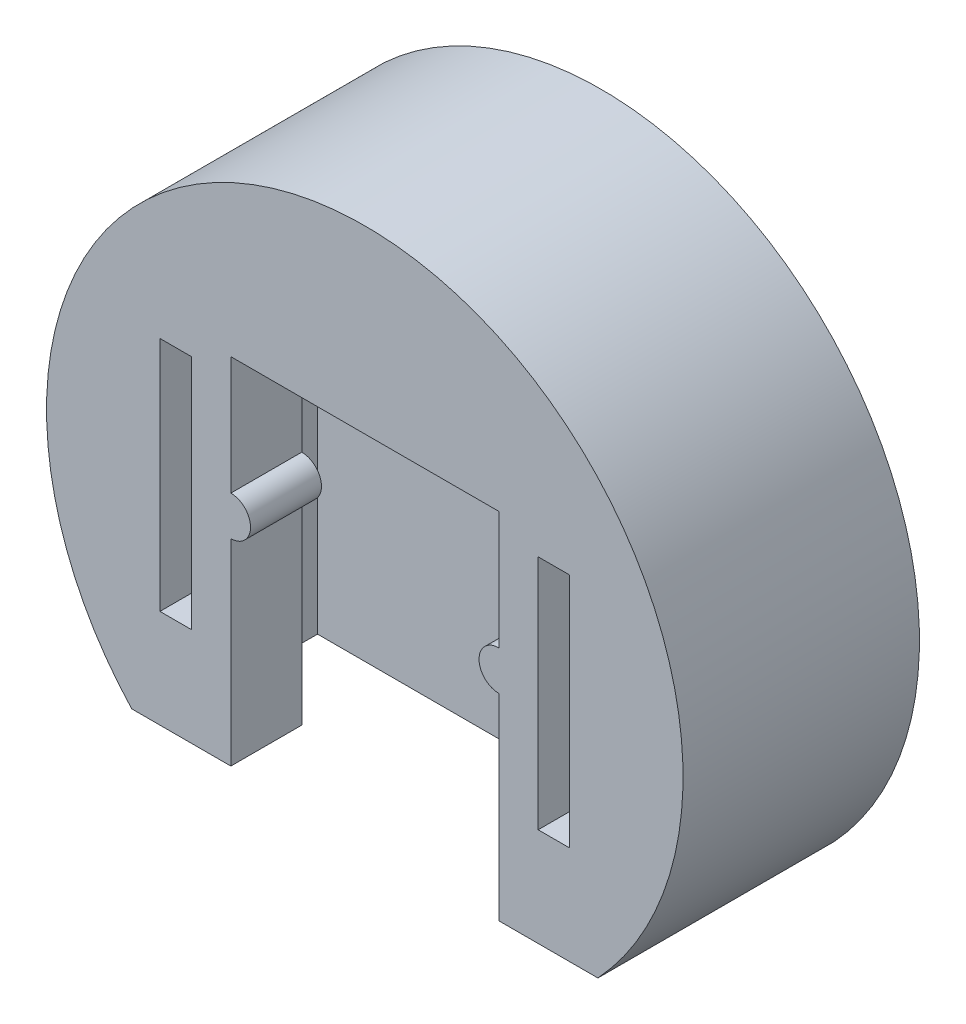
ISO-10303-21;
HEADER;
FILE_DESCRIPTION(('STEP AP214'),'2;1');
FILE_NAME('part.step','',(''),(''),'','','');
FILE_SCHEMA(('AUTOMOTIVE_DESIGN { 1 0 10303 214 1 1 1 1 }'));
ENDSEC;
DATA;
#1=APPLICATION_CONTEXT('core data for automotive mechanical design processes');
#2=APPLICATION_PROTOCOL_DEFINITION('international standard','automotive_design',2000,#1);
#3=PRODUCT_CONTEXT('',#1,'mechanical');
#4=PRODUCT('Part','Part','',(#3));
#5=PRODUCT_RELATED_PRODUCT_CATEGORY('part','',(#4));
#6=PRODUCT_DEFINITION_FORMATION('','',#4);
#7=PRODUCT_DEFINITION_CONTEXT('part definition',#1,'design');
#8=PRODUCT_DEFINITION('design','',#6,#7);
#9=PRODUCT_DEFINITION_SHAPE('','',#8);
#10=(LENGTH_UNIT() NAMED_UNIT(*) SI_UNIT(.MILLI.,.METRE.));
#11=(NAMED_UNIT(*) PLANE_ANGLE_UNIT() SI_UNIT($,.RADIAN.));
#12=(NAMED_UNIT(*) SI_UNIT($,.STERADIAN.) SOLID_ANGLE_UNIT());
#13=UNCERTAINTY_MEASURE_WITH_UNIT(LENGTH_MEASURE(1.E-05),#10,'distance_accuracy_value','');
#14=(GEOMETRIC_REPRESENTATION_CONTEXT(3) GLOBAL_UNCERTAINTY_ASSIGNED_CONTEXT((#13)) GLOBAL_UNIT_ASSIGNED_CONTEXT((#10,
#11,#12)) REPRESENTATION_CONTEXT('',''));
#15=CARTESIAN_POINT('',(0.,0.,0.));
#16=DIRECTION('',(0.,0.,1.));
#17=DIRECTION('',(1.,0.,0.));
#18=AXIS2_PLACEMENT_3D('',#15,#16,#17);
#19=CARTESIAN_POINT('',(3.4,3.5,2.));
#20=DIRECTION('',(1.,0.,0.));
#21=DIRECTION('',(0.,1.,0.));
#22=AXIS2_PLACEMENT_3D('',#19,#20,#21);
#23=PLANE('',#22);
#24=DIRECTION('',(0.,-1.,0.));
#25=VECTOR('',#24,1.);
#26=CARTESIAN_POINT('',(3.4,3.5,4.2));
#27=LINE('',#26,#25);
#28=CARTESIAN_POINT('',(3.4,3.5,4.2));
#29=VERTEX_POINT('',#28);
#30=CARTESIAN_POINT('',(3.4,0.5,4.2));
#31=VERTEX_POINT('',#30);
#32=EDGE_CURVE('E205',#29,#31,#27,.T.);
#33=ORIENTED_EDGE('',*,*,#32,.T.);
#34=DIRECTION('',(0.,0.,1.));
#35=VECTOR('',#34,1.);
#36=CARTESIAN_POINT('',(3.4,0.5,2.78578643762691));
#37=LINE('',#36,#35);
#38=CARTESIAN_POINT('',(3.4,0.5,6.));
#39=VERTEX_POINT('',#38);
#40=EDGE_CURVE('E216',#31,#39,#37,.T.);
#41=ORIENTED_EDGE('',*,*,#40,.T.);
#42=DIRECTION('',(0.,1.,0.));
#43=VECTOR('',#42,1.);
#44=CARTESIAN_POINT('',(3.4,3.5,6.));
#45=LINE('',#44,#43);
#46=CARTESIAN_POINT('',(3.4,3.5,6.));
#47=VERTEX_POINT('',#46);
#48=EDGE_CURVE('E328',#39,#47,#45,.T.);
#49=ORIENTED_EDGE('',*,*,#48,.T.);
#50=DIRECTION('',(0.,0.,1.));
#51=VECTOR('',#50,1.);
#52=CARTESIAN_POINT('',(3.4,3.5,2.));
#53=LINE('',#52,#51);
#54=EDGE_CURVE('E335',#29,#47,#53,.T.);
#55=ORIENTED_EDGE('',*,*,#54,.F.);
#56=EDGE_LOOP('',(#33,#41,#49,#55));
#57=FACE_BOUND('',#56,.T.);
#58=ADVANCED_FACE('F32',(#57),#23,.F.);
#59=CARTESIAN_POINT('',(-3.4,3.5,2.));
#60=DIRECTION('',(-1.,0.,0.));
#61=DIRECTION('',(0.,-1.,0.));
#62=AXIS2_PLACEMENT_3D('',#59,#60,#61);
#63=PLANE('',#62);
#64=DIRECTION('',(0.,1.,0.));
#65=VECTOR('',#64,1.);
#66=CARTESIAN_POINT('',(-3.4,3.5,4.2));
#67=LINE('',#66,#65);
#68=CARTESIAN_POINT('',(-3.4,-5.5,4.2));
#69=VERTEX_POINT('',#68);
#70=CARTESIAN_POINT('',(-3.4,-0.5,4.2));
#71=VERTEX_POINT('',#70);
#72=EDGE_CURVE('E319',#69,#71,#67,.T.);
#73=ORIENTED_EDGE('',*,*,#72,.T.);
#74=DIRECTION('',(0.,0.,1.));
#75=VECTOR('',#74,1.);
#76=CARTESIAN_POINT('',(-3.4,-0.5,2.78578643762691));
#77=LINE('',#76,#75);
#78=CARTESIAN_POINT('',(-3.4,-0.5,6.));
#79=VERTEX_POINT('',#78);
#80=EDGE_CURVE('E234',#71,#79,#77,.T.);
#81=ORIENTED_EDGE('',*,*,#80,.T.);
#82=DIRECTION('',(0.,-1.,0.));
#83=VECTOR('',#82,1.);
#84=CARTESIAN_POINT('',(-3.4,3.5,6.));
#85=LINE('',#84,#83);
#86=CARTESIAN_POINT('',(-3.4,-5.5,6.));
#87=VERTEX_POINT('',#86);
#88=EDGE_CURVE('E321',#79,#87,#85,.T.);
#89=ORIENTED_EDGE('',*,*,#88,.T.);
#90=DIRECTION('',(0.,0.,1.));
#91=VECTOR('',#90,1.);
#92=CARTESIAN_POINT('',(-3.4,-5.5,2.));
#93=LINE('',#92,#91);
#94=EDGE_CURVE('E324',#69,#87,#93,.T.);
#95=ORIENTED_EDGE('',*,*,#94,.F.);
#96=EDGE_LOOP('',(#73,#81,#89,#95));
#97=FACE_BOUND('',#96,.T.);
#98=ADVANCED_FACE('F404',(#97),#63,.F.);
#99=CARTESIAN_POINT('',(0.,0.,6.));
#100=DIRECTION('',(0.,0.,-1.));
#101=DIRECTION('',(-1.,0.,0.));
#102=AXIS2_PLACEMENT_3D('',#99,#100,#101);
#103=CYLINDRICAL_SURFACE('',#102,8.07774721070176);
#104=CARTESIAN_POINT('',(0.,0.,0.));
#105=DIRECTION('',(0.,0.,1.));
#106=DIRECTION('',(1.,0.,0.));
#107=AXIS2_PLACEMENT_3D('',#104,#105,#106);
#108=CIRCLE('',#107,8.07774721070176);
#109=CARTESIAN_POINT('',(5.91607978309962,-5.5,0.));
#110=VERTEX_POINT('',#109);
#111=CARTESIAN_POINT('',(-5.91607978309962,-5.5,0.));
#112=VERTEX_POINT('',#111);
#113=EDGE_CURVE('E334',#110,#112,#108,.T.);
#114=ORIENTED_EDGE('',*,*,#113,.T.);
#115=DIRECTION('',(0.,0.,-1.));
#116=VECTOR('',#115,1.);
#117=CARTESIAN_POINT('',(-5.91607978309962,-5.5,6.));
#118=LINE('',#117,#116);
#119=CARTESIAN_POINT('',(-5.91607978309962,-5.5,6.));
#120=VERTEX_POINT('',#119);
#121=EDGE_CURVE('E206',#120,#112,#118,.T.);
#122=ORIENTED_EDGE('',*,*,#121,.F.);
#123=CARTESIAN_POINT('',(0.,0.,6.));
#124=DIRECTION('',(0.,0.,1.));
#125=DIRECTION('',(1.,0.,0.));
#126=AXIS2_PLACEMENT_3D('',#123,#124,#125);
#127=CIRCLE('',#126,8.07774721070176);
#128=CARTESIAN_POINT('',(5.91607978309962,-5.5,6.));
#129=VERTEX_POINT('',#128);
#130=EDGE_CURVE('E342',#129,#120,#127,.T.);
#131=ORIENTED_EDGE('',*,*,#130,.F.);
#132=DIRECTION('',(0.,0.,-1.));
#133=VECTOR('',#132,1.);
#134=CARTESIAN_POINT('',(5.91607978309962,-5.5,6.));
#135=LINE('',#134,#133);
#136=EDGE_CURVE('E350',#129,#110,#135,.T.);
#137=ORIENTED_EDGE('',*,*,#136,.T.);
#138=EDGE_LOOP('',(#114,#122,#131,#137));
#139=FACE_BOUND('',#138,.T.);
#140=ADVANCED_FACE('F410',(#139),#103,.T.);
#141=CARTESIAN_POINT('',(5.91607978309962,-5.5,6.));
#142=DIRECTION('',(0.,1.,0.));
#143=DIRECTION('',(-1.,0.,0.));
#144=AXIS2_PLACEMENT_3D('',#141,#142,#143);
#145=PLANE('',#144);
#146=DIRECTION('',(0.,0.,-1.));
#147=VECTOR('',#146,1.);
#148=CARTESIAN_POINT('',(-5.2,-5.5,4.2));
#149=LINE('',#148,#147);
#150=CARTESIAN_POINT('',(-5.2,-5.5,4.2));
#151=VERTEX_POINT('',#150);
#152=CARTESIAN_POINT('',(-5.2,-5.5,2.));
#153=VERTEX_POINT('',#152);
#154=EDGE_CURVE('E312',#151,#153,#149,.T.);
#155=ORIENTED_EDGE('',*,*,#154,.F.);
#156=DIRECTION('',(1.,0.,0.));
#157=VECTOR('',#156,1.);
#158=CARTESIAN_POINT('',(-5.2,-5.5,4.2));
#159=LINE('',#158,#157);
#160=EDGE_CURVE('E292',#151,#69,#159,.T.);
#161=ORIENTED_EDGE('',*,*,#160,.T.);
#162=ORIENTED_EDGE('',*,*,#94,.T.);
#163=DIRECTION('',(1.,0.,0.));
#164=VECTOR('',#163,1.);
#165=CARTESIAN_POINT('',(5.91607978309962,-5.5,6.));
#166=LINE('',#165,#164);
#167=EDGE_CURVE('E347',#120,#87,#166,.T.);
#168=ORIENTED_EDGE('',*,*,#167,.F.);
#169=ORIENTED_EDGE('',*,*,#121,.T.);
#170=DIRECTION('',(1.,0.,0.));
#171=VECTOR('',#170,1.);
#172=CARTESIAN_POINT('',(5.91607978309962,-5.5,0.));
#173=LINE('',#172,#171);
#174=EDGE_CURVE('E346',#112,#110,#173,.T.);
#175=ORIENTED_EDGE('',*,*,#174,.T.);
#176=ORIENTED_EDGE('',*,*,#136,.F.);
#177=CARTESIAN_POINT('',(3.4,-5.5,6.));
#178=VERTEX_POINT('',#177);
#179=EDGE_CURVE('E345',#178,#129,#166,.T.);
#180=ORIENTED_EDGE('',*,*,#179,.F.);
#181=DIRECTION('',(0.,0.,1.));
#182=VECTOR('',#181,1.);
#183=CARTESIAN_POINT('',(3.4,-5.5,2.));
#184=LINE('',#183,#182);
#185=CARTESIAN_POINT('',(3.4,-5.5,4.2));
#186=VERTEX_POINT('',#185);
#187=EDGE_CURVE('E338',#186,#178,#184,.T.);
#188=ORIENTED_EDGE('',*,*,#187,.F.);
#189=CARTESIAN_POINT('',(5.2,-5.5,4.2));
#190=VERTEX_POINT('',#189);
#191=EDGE_CURVE('E202',#186,#190,#159,.T.);
#192=ORIENTED_EDGE('',*,*,#191,.T.);
#193=DIRECTION('',(0.,0.,-1.));
#194=VECTOR('',#193,1.);
#195=CARTESIAN_POINT('',(5.2,-5.5,4.2));
#196=LINE('',#195,#194);
#197=CARTESIAN_POINT('',(5.2,-5.5,2.));
#198=VERTEX_POINT('',#197);
#199=EDGE_CURVE('E302',#190,#198,#196,.T.);
#200=ORIENTED_EDGE('',*,*,#199,.T.);
#201=DIRECTION('',(1.,0.,0.));
#202=VECTOR('',#201,1.);
#203=CARTESIAN_POINT('',(-3.4,-5.5,2.));
#204=LINE('',#203,#202);
#205=EDGE_CURVE('E322',#153,#198,#204,.T.);
#206=ORIENTED_EDGE('',*,*,#205,.F.);
#207=EDGE_LOOP('',(#155,#161,#162,#168,#169,#175,#176,#180,#188,#192,#200,#206));
#208=FACE_BOUND('',#207,.T.);
#209=ADVANCED_FACE('F391',(#208),#145,.F.);
#210=CARTESIAN_POINT('',(0.,0.,6.));
#211=DIRECTION('',(0.,0.,1.));
#212=DIRECTION('',(1.,0.,0.));
#213=AXIS2_PLACEMENT_3D('',#210,#211,#212);
#214=PLANE('',#213);
#215=ORIENTED_EDGE('',*,*,#48,.F.);
#216=CARTESIAN_POINT('',(3.4,0.,6.));
#217=DIRECTION('',(0.,0.,1.));
#218=DIRECTION('',(1.,0.,0.));
#219=AXIS2_PLACEMENT_3D('',#216,#217,#218);
#220=CIRCLE('',#219,0.5);
#221=CARTESIAN_POINT('',(3.4,-0.5,6.));
#222=VERTEX_POINT('',#221);
#223=EDGE_CURVE('E220',#39,#222,#220,.T.);
#224=ORIENTED_EDGE('',*,*,#223,.T.);
#225=EDGE_CURVE('E212',#178,#222,#45,.T.);
#226=ORIENTED_EDGE('',*,*,#225,.F.);
#227=ORIENTED_EDGE('',*,*,#179,.T.);
#228=ORIENTED_EDGE('',*,*,#130,.T.);
#229=ORIENTED_EDGE('',*,*,#167,.T.);
#230=ORIENTED_EDGE('',*,*,#88,.F.);
#231=CARTESIAN_POINT('',(-3.4,0.,6.));
#232=DIRECTION('',(0.,0.,1.));
#233=DIRECTION('',(1.,0.,0.));
#234=AXIS2_PLACEMENT_3D('',#231,#232,#233);
#235=CIRCLE('',#234,0.5);
#236=CARTESIAN_POINT('',(-3.4,0.5,6.));
#237=VERTEX_POINT('',#236);
#238=EDGE_CURVE('E225',#79,#237,#235,.T.);
#239=ORIENTED_EDGE('',*,*,#238,.T.);
#240=CARTESIAN_POINT('',(-3.4,3.5,6.));
#241=VERTEX_POINT('',#240);
#242=EDGE_CURVE('E326',#241,#237,#85,.T.);
#243=ORIENTED_EDGE('',*,*,#242,.F.);
#244=DIRECTION('',(-1.,0.,0.));
#245=VECTOR('',#244,1.);
#246=CARTESIAN_POINT('',(-3.4,3.5,6.));
#247=LINE('',#246,#245);
#248=EDGE_CURVE('E325',#47,#241,#247,.T.);
#249=ORIENTED_EDGE('',*,*,#248,.F.);
#250=EDGE_LOOP('',(#215,#224,#226,#227,#228,#229,#230,#239,#243,#249));
#251=FACE_BOUND('',#250,.T.);
#252=DIRECTION('',(0.,-1.,0.));
#253=VECTOR('',#252,1.);
#254=CARTESIAN_POINT('',(-5.2,-3.,6.));
#255=LINE('',#254,#253);
#256=CARTESIAN_POINT('',(-5.2,3.,6.));
#257=VERTEX_POINT('',#256);
#258=CARTESIAN_POINT('',(-5.2,-3.,6.));
#259=VERTEX_POINT('',#258);
#260=EDGE_CURVE('E237',#257,#259,#255,.T.);
#261=ORIENTED_EDGE('',*,*,#260,.F.);
#262=DIRECTION('',(-1.,0.,0.));
#263=VECTOR('',#262,1.);
#264=CARTESIAN_POINT('',(-5.2,3.,6.));
#265=LINE('',#264,#263);
#266=CARTESIAN_POINT('',(-4.4,3.,6.));
#267=VERTEX_POINT('',#266);
#268=EDGE_CURVE('E246',#267,#257,#265,.T.);
#269=ORIENTED_EDGE('',*,*,#268,.F.);
#270=DIRECTION('',(0.,1.,0.));
#271=VECTOR('',#270,1.);
#272=CARTESIAN_POINT('',(-4.4,-3.,6.));
#273=LINE('',#272,#271);
#274=CARTESIAN_POINT('',(-4.4,-3.,6.));
#275=VERTEX_POINT('',#274);
#276=EDGE_CURVE('E243',#275,#267,#273,.T.);
#277=ORIENTED_EDGE('',*,*,#276,.F.);
#278=DIRECTION('',(1.,0.,0.));
#279=VECTOR('',#278,1.);
#280=CARTESIAN_POINT('',(-5.2,-3.,6.));
#281=LINE('',#280,#279);
#282=EDGE_CURVE('E239',#259,#275,#281,.T.);
#283=ORIENTED_EDGE('',*,*,#282,.F.);
#284=EDGE_LOOP('',(#261,#269,#277,#283));
#285=FACE_BOUND('',#284,.T.);
#286=DIRECTION('',(0.,-1.,0.));
#287=VECTOR('',#286,1.);
#288=CARTESIAN_POINT('',(4.4,3.,6.));
#289=LINE('',#288,#287);
#290=CARTESIAN_POINT('',(4.4,3.,6.));
#291=VERTEX_POINT('',#290);
#292=CARTESIAN_POINT('',(4.4,-3.,6.));
#293=VERTEX_POINT('',#292);
#294=EDGE_CURVE('E236',#291,#293,#289,.T.);
#295=ORIENTED_EDGE('',*,*,#294,.F.);
#296=DIRECTION('',(-1.,0.,0.));
#297=VECTOR('',#296,1.);
#298=CARTESIAN_POINT('',(4.4,3.,6.));
#299=LINE('',#298,#297);
#300=CARTESIAN_POINT('',(5.2,3.,6.));
#301=VERTEX_POINT('',#300);
#302=EDGE_CURVE('E266',#301,#291,#299,.T.);
#303=ORIENTED_EDGE('',*,*,#302,.F.);
#304=DIRECTION('',(0.,1.,0.));
#305=VECTOR('',#304,1.);
#306=CARTESIAN_POINT('',(5.2,3.,6.));
#307=LINE('',#306,#305);
#308=CARTESIAN_POINT('',(5.2,-3.,6.));
#309=VERTEX_POINT('',#308);
#310=EDGE_CURVE('E263',#309,#301,#307,.T.);
#311=ORIENTED_EDGE('',*,*,#310,.F.);
#312=DIRECTION('',(1.,0.,0.));
#313=VECTOR('',#312,1.);
#314=CARTESIAN_POINT('',(4.4,-3.,6.));
#315=LINE('',#314,#313);
#316=EDGE_CURVE('E260',#293,#309,#315,.T.);
#317=ORIENTED_EDGE('',*,*,#316,.F.);
#318=EDGE_LOOP('',(#295,#303,#311,#317));
#319=FACE_BOUND('',#318,.T.);
#320=ADVANCED_FACE('F532',(#251,#285,#319),#214,.T.);
#321=CARTESIAN_POINT('',(0.,0.,0.));
#322=DIRECTION('',(0.,0.,1.));
#323=DIRECTION('',(1.,0.,0.));
#324=AXIS2_PLACEMENT_3D('',#321,#322,#323);
#325=PLANE('',#324);
#326=ORIENTED_EDGE('',*,*,#113,.F.);
#327=ORIENTED_EDGE('',*,*,#174,.F.);
#328=EDGE_LOOP('',(#326,#327));
#329=FACE_BOUND('',#328,.T.);
#330=ADVANCED_FACE('F426',(#329),#325,.F.);
#331=ORIENTED_EDGE('',*,*,#242,.T.);
#332=DIRECTION('',(0.,0.,1.));
#333=VECTOR('',#332,1.);
#334=CARTESIAN_POINT('',(-3.4,0.5,2.78578643762691));
#335=LINE('',#334,#333);
#336=CARTESIAN_POINT('',(-3.4,0.5,4.2));
#337=VERTEX_POINT('',#336);
#338=EDGE_CURVE('E231',#237,#337,#335,.F.);
#339=ORIENTED_EDGE('',*,*,#338,.T.);
#340=CARTESIAN_POINT('',(-3.4,3.5,4.2));
#341=VERTEX_POINT('',#340);
#342=EDGE_CURVE('E318',#337,#341,#67,.T.);
#343=ORIENTED_EDGE('',*,*,#342,.T.);
#344=DIRECTION('',(0.,0.,1.));
#345=VECTOR('',#344,1.);
#346=CARTESIAN_POINT('',(-3.4,3.5,2.));
#347=LINE('',#346,#345);
#348=EDGE_CURVE('E332',#341,#241,#347,.T.);
#349=ORIENTED_EDGE('',*,*,#348,.T.);
#350=EDGE_LOOP('',(#331,#339,#343,#349));
#351=FACE_BOUND('',#350,.T.);
#352=ADVANCED_FACE('F413',(#351),#63,.F.);
#353=CARTESIAN_POINT('',(-3.4,3.5,2.));
#354=DIRECTION('',(0.,1.,0.));
#355=DIRECTION('',(-1.,0.,0.));
#356=AXIS2_PLACEMENT_3D('',#353,#354,#355);
#357=PLANE('',#356);
#358=ORIENTED_EDGE('',*,*,#348,.F.);
#359=DIRECTION('',(1.,0.,0.));
#360=VECTOR('',#359,1.);
#361=CARTESIAN_POINT('',(-3.4,3.5,4.2));
#362=LINE('',#361,#360);
#363=EDGE_CURVE('E315',#341,#29,#362,.T.);
#364=ORIENTED_EDGE('',*,*,#363,.T.);
#365=ORIENTED_EDGE('',*,*,#54,.T.);
#366=ORIENTED_EDGE('',*,*,#248,.T.);
#367=EDGE_LOOP('',(#358,#364,#365,#366));
#368=FACE_BOUND('',#367,.T.);
#369=ADVANCED_FACE('F416',(#368),#357,.F.);
#370=ORIENTED_EDGE('',*,*,#225,.T.);
#371=DIRECTION('',(0.,0.,1.));
#372=VECTOR('',#371,1.);
#373=CARTESIAN_POINT('',(3.4,-0.5,2.78578643762691));
#374=LINE('',#373,#372);
#375=CARTESIAN_POINT('',(3.4,-0.5,4.2));
#376=VERTEX_POINT('',#375);
#377=EDGE_CURVE('E209',#222,#376,#374,.F.);
#378=ORIENTED_EDGE('',*,*,#377,.T.);
#379=EDGE_CURVE('E195',#376,#186,#27,.T.);
#380=ORIENTED_EDGE('',*,*,#379,.T.);
#381=ORIENTED_EDGE('',*,*,#187,.T.);
#382=EDGE_LOOP('',(#370,#378,#380,#381));
#383=FACE_BOUND('',#382,.T.);
#384=ADVANCED_FACE('F210',(#383),#23,.F.);
#385=CARTESIAN_POINT('',(0.,0.,2.));
#386=DIRECTION('',(0.,0.,1.));
#387=DIRECTION('',(1.,0.,0.));
#388=AXIS2_PLACEMENT_3D('',#385,#386,#387);
#389=PLANE('',#388);
#390=DIRECTION('',(-1.,0.,0.));
#391=VECTOR('',#390,1.);
#392=CARTESIAN_POINT('',(-5.2,5.1,2.));
#393=LINE('',#392,#391);
#394=CARTESIAN_POINT('',(4.7,5.1,2.));
#395=VERTEX_POINT('',#394);
#396=CARTESIAN_POINT('',(-4.7,5.1,2.));
#397=VERTEX_POINT('',#396);
#398=EDGE_CURVE('E307',#395,#397,#393,.T.);
#399=ORIENTED_EDGE('',*,*,#398,.T.);
#400=CARTESIAN_POINT('',(-4.7,4.6,2.));
#401=DIRECTION('',(0.,0.,1.));
#402=DIRECTION('',(1.,0.,0.));
#403=AXIS2_PLACEMENT_3D('',#400,#401,#402);
#404=CIRCLE('',#403,0.5);
#405=CARTESIAN_POINT('',(-5.2,4.6,2.));
#406=VERTEX_POINT('',#405);
#407=EDGE_CURVE('E371',#397,#406,#404,.T.);
#408=ORIENTED_EDGE('',*,*,#407,.T.);
#409=DIRECTION('',(0.,-1.,0.));
#410=VECTOR('',#409,1.);
#411=CARTESIAN_POINT('',(-5.2,5.1,2.));
#412=LINE('',#411,#410);
#413=EDGE_CURVE('E288',#406,#153,#412,.T.);
#414=ORIENTED_EDGE('',*,*,#413,.T.);
#415=ORIENTED_EDGE('',*,*,#205,.T.);
#416=DIRECTION('',(0.,1.,0.));
#417=VECTOR('',#416,1.);
#418=CARTESIAN_POINT('',(5.2,5.1,2.));
#419=LINE('',#418,#417);
#420=CARTESIAN_POINT('',(5.2,4.6,2.));
#421=VERTEX_POINT('',#420);
#422=EDGE_CURVE('E304',#198,#421,#419,.T.);
#423=ORIENTED_EDGE('',*,*,#422,.T.);
#424=CARTESIAN_POINT('',(4.7,4.6,2.));
#425=DIRECTION('',(0.,0.,1.));
#426=DIRECTION('',(1.,0.,0.));
#427=AXIS2_PLACEMENT_3D('',#424,#425,#426);
#428=CIRCLE('',#427,0.5);
#429=EDGE_CURVE('E369',#421,#395,#428,.T.);
#430=ORIENTED_EDGE('',*,*,#429,.T.);
#431=EDGE_LOOP('',(#399,#408,#414,#415,#423,#430));
#432=FACE_BOUND('',#431,.T.);
#433=ADVANCED_FACE('F383',(#432),#389,.T.);
#434=CARTESIAN_POINT('',(0.,0.,4.2));
#435=DIRECTION('',(0.,0.,1.));
#436=DIRECTION('',(1.,0.,0.));
#437=AXIS2_PLACEMENT_3D('',#434,#435,#436);
#438=PLANE('',#437);
#439=DIRECTION('',(0.,-1.,0.));
#440=VECTOR('',#439,1.);
#441=CARTESIAN_POINT('',(-5.2,5.1,4.2));
#442=LINE('',#441,#440);
#443=CARTESIAN_POINT('',(-5.2,4.6,4.2));
#444=VERTEX_POINT('',#443);
#445=CARTESIAN_POINT('',(-5.2,3.,4.2));
#446=VERTEX_POINT('',#445);
#447=EDGE_CURVE('E289',#444,#446,#442,.T.);
#448=ORIENTED_EDGE('',*,*,#447,.F.);
#449=CARTESIAN_POINT('',(-4.7,4.6,4.2));
#450=DIRECTION('',(0.,0.,1.));
#451=DIRECTION('',(1.,0.,0.));
#452=AXIS2_PLACEMENT_3D('',#449,#450,#451);
#453=CIRCLE('',#452,0.5);
#454=CARTESIAN_POINT('',(-4.7,5.1,4.2));
#455=VERTEX_POINT('',#454);
#456=EDGE_CURVE('E40',#444,#455,#453,.F.);
#457=ORIENTED_EDGE('',*,*,#456,.T.);
#458=DIRECTION('',(-1.,0.,0.));
#459=VECTOR('',#458,1.);
#460=CARTESIAN_POINT('',(-5.2,5.1,4.2));
#461=LINE('',#460,#459);
#462=CARTESIAN_POINT('',(4.7,5.1,4.2));
#463=VERTEX_POINT('',#462);
#464=EDGE_CURVE('E299',#463,#455,#461,.T.);
#465=ORIENTED_EDGE('',*,*,#464,.F.);
#466=CARTESIAN_POINT('',(4.7,4.6,4.2));
#467=DIRECTION('',(0.,0.,1.));
#468=DIRECTION('',(1.,0.,0.));
#469=AXIS2_PLACEMENT_3D('',#466,#467,#468);
#470=CIRCLE('',#469,0.5);
#471=CARTESIAN_POINT('',(5.2,4.6,4.2));
#472=VERTEX_POINT('',#471);
#473=EDGE_CURVE('E47',#463,#472,#470,.F.);
#474=ORIENTED_EDGE('',*,*,#473,.T.);
#475=DIRECTION('',(0.,1.,0.));
#476=VECTOR('',#475,1.);
#477=CARTESIAN_POINT('',(5.2,5.1,4.2));
#478=LINE('',#477,#476);
#479=CARTESIAN_POINT('',(5.2,3.,4.2));
#480=VERTEX_POINT('',#479);
#481=EDGE_CURVE('E295',#480,#472,#478,.T.);
#482=ORIENTED_EDGE('',*,*,#481,.F.);
#483=DIRECTION('',(-1.,0.,0.));
#484=VECTOR('',#483,1.);
#485=CARTESIAN_POINT('',(0.,3.,4.2));
#486=LINE('',#485,#484);
#487=CARTESIAN_POINT('',(4.4,3.,4.2));
#488=VERTEX_POINT('',#487);
#489=EDGE_CURVE('E279',#480,#488,#486,.T.);
#490=ORIENTED_EDGE('',*,*,#489,.T.);
#491=DIRECTION('',(0.,-1.,0.));
#492=VECTOR('',#491,1.);
#493=CARTESIAN_POINT('',(4.4,0.,4.2));
#494=LINE('',#493,#492);
#495=CARTESIAN_POINT('',(4.4,-3.,4.2));
#496=VERTEX_POINT('',#495);
#497=EDGE_CURVE('E358',#488,#496,#494,.T.);
#498=ORIENTED_EDGE('',*,*,#497,.T.);
#499=DIRECTION('',(1.,0.,0.));
#500=VECTOR('',#499,1.);
#501=CARTESIAN_POINT('',(0.,-3.,4.2));
#502=LINE('',#501,#500);
#503=CARTESIAN_POINT('',(5.2,-3.,4.2));
#504=VERTEX_POINT('',#503);
#505=EDGE_CURVE('E252',#496,#504,#502,.T.);
#506=ORIENTED_EDGE('',*,*,#505,.T.);
#507=EDGE_CURVE('E296',#190,#504,#478,.T.);
#508=ORIENTED_EDGE('',*,*,#507,.F.);
#509=ORIENTED_EDGE('',*,*,#191,.F.);
#510=ORIENTED_EDGE('',*,*,#379,.F.);
#511=CARTESIAN_POINT('',(3.4,0.,4.2));
#512=DIRECTION('',(0.,0.,1.));
#513=DIRECTION('',(1.,0.,0.));
#514=AXIS2_PLACEMENT_3D('',#511,#512,#513);
#515=CIRCLE('',#514,0.5);
#516=EDGE_CURVE('E199',#376,#31,#515,.F.);
#517=ORIENTED_EDGE('',*,*,#516,.T.);
#518=ORIENTED_EDGE('',*,*,#32,.F.);
#519=ORIENTED_EDGE('',*,*,#363,.F.);
#520=ORIENTED_EDGE('',*,*,#342,.F.);
#521=CARTESIAN_POINT('',(-3.4,0.,4.2));
#522=DIRECTION('',(0.,0.,1.));
#523=DIRECTION('',(1.,0.,0.));
#524=AXIS2_PLACEMENT_3D('',#521,#522,#523);
#525=CIRCLE('',#524,0.5);
#526=EDGE_CURVE('E228',#337,#71,#525,.F.);
#527=ORIENTED_EDGE('',*,*,#526,.T.);
#528=ORIENTED_EDGE('',*,*,#72,.F.);
#529=ORIENTED_EDGE('',*,*,#160,.F.);
#530=CARTESIAN_POINT('',(-5.2,-3.,4.2));
#531=VERTEX_POINT('',#530);
#532=EDGE_CURVE('E291',#531,#151,#442,.T.);
#533=ORIENTED_EDGE('',*,*,#532,.F.);
#534=DIRECTION('',(1.,0.,0.));
#535=VECTOR('',#534,1.);
#536=CARTESIAN_POINT('',(0.,-3.,4.2));
#537=LINE('',#536,#535);
#538=CARTESIAN_POINT('',(-4.4,-3.,4.2));
#539=VERTEX_POINT('',#538);
#540=EDGE_CURVE('E282',#531,#539,#537,.T.);
#541=ORIENTED_EDGE('',*,*,#540,.T.);
#542=DIRECTION('',(0.,1.,0.));
#543=VECTOR('',#542,1.);
#544=CARTESIAN_POINT('',(-4.4,0.,4.2));
#545=LINE('',#544,#543);
#546=CARTESIAN_POINT('',(-4.4,3.,4.2));
#547=VERTEX_POINT('',#546);
#548=EDGE_CURVE('E361',#539,#547,#545,.T.);
#549=ORIENTED_EDGE('',*,*,#548,.T.);
#550=DIRECTION('',(-1.,0.,0.));
#551=VECTOR('',#550,1.);
#552=CARTESIAN_POINT('',(0.,3.,4.2));
#553=LINE('',#552,#551);
#554=EDGE_CURVE('E285',#547,#446,#553,.T.);
#555=ORIENTED_EDGE('',*,*,#554,.T.);
#556=EDGE_LOOP('',(#448,#457,#465,#474,#482,#490,#498,#506,#508,#509,#510,#517,#518,#519,#520,
#527,#528,#529,#533,#541,#549,#555));
#557=FACE_BOUND('',#556,.T.);
#558=ADVANCED_FACE('F197',(#557),#438,.F.);
#559=CARTESIAN_POINT('',(-5.2,5.1,4.2));
#560=DIRECTION('',(1.,0.,0.));
#561=DIRECTION('',(0.,1.,0.));
#562=AXIS2_PLACEMENT_3D('',#559,#560,#561);
#563=PLANE('',#562);
#564=ORIENTED_EDGE('',*,*,#413,.F.);
#565=DIRECTION('',(0.,0.,-1.));
#566=VECTOR('',#565,1.);
#567=CARTESIAN_POINT('',(-5.2,4.6,4.2));
#568=LINE('',#567,#566);
#569=EDGE_CURVE('E55',#406,#444,#568,.F.);
#570=ORIENTED_EDGE('',*,*,#569,.T.);
#571=ORIENTED_EDGE('',*,*,#447,.T.);
#572=DIRECTION('',(0.,0.,1.));
#573=VECTOR('',#572,1.);
#574=CARTESIAN_POINT('',(-5.2,3.,3.8));
#575=LINE('',#574,#573);
#576=EDGE_CURVE('E250',#446,#257,#575,.T.);
#577=ORIENTED_EDGE('',*,*,#576,.T.);
#578=ORIENTED_EDGE('',*,*,#260,.T.);
#579=DIRECTION('',(0.,0.,1.));
#580=VECTOR('',#579,1.);
#581=CARTESIAN_POINT('',(-5.2,-3.,3.8));
#582=LINE('',#581,#580);
#583=EDGE_CURVE('E249',#531,#259,#582,.T.);
#584=ORIENTED_EDGE('',*,*,#583,.F.);
#585=ORIENTED_EDGE('',*,*,#532,.T.);
#586=ORIENTED_EDGE('',*,*,#154,.T.);
#587=EDGE_LOOP('',(#564,#570,#571,#577,#578,#584,#585,#586));
#588=FACE_BOUND('',#587,.T.);
#589=ADVANCED_FACE('F385',(#588),#563,.T.);
#590=CARTESIAN_POINT('',(5.2,5.1,4.2));
#591=DIRECTION('',(-1.,0.,0.));
#592=DIRECTION('',(0.,-1.,0.));
#593=AXIS2_PLACEMENT_3D('',#590,#591,#592);
#594=PLANE('',#593);
#595=ORIENTED_EDGE('',*,*,#481,.T.);
#596=DIRECTION('',(0.,0.,-1.));
#597=VECTOR('',#596,1.);
#598=CARTESIAN_POINT('',(5.2,4.6,2.));
#599=LINE('',#598,#597);
#600=EDGE_CURVE('E11',#472,#421,#599,.T.);
#601=ORIENTED_EDGE('',*,*,#600,.T.);
#602=ORIENTED_EDGE('',*,*,#422,.F.);
#603=ORIENTED_EDGE('',*,*,#199,.F.);
#604=ORIENTED_EDGE('',*,*,#507,.T.);
#605=DIRECTION('',(0.,0.,1.));
#606=VECTOR('',#605,1.);
#607=CARTESIAN_POINT('',(5.2,-3.,3.8));
#608=LINE('',#607,#606);
#609=EDGE_CURVE('E273',#504,#309,#608,.T.);
#610=ORIENTED_EDGE('',*,*,#609,.T.);
#611=ORIENTED_EDGE('',*,*,#310,.T.);
#612=DIRECTION('',(0.,0.,1.));
#613=VECTOR('',#612,1.);
#614=CARTESIAN_POINT('',(5.2,3.,3.8));
#615=LINE('',#614,#613);
#616=EDGE_CURVE('E271',#480,#301,#615,.T.);
#617=ORIENTED_EDGE('',*,*,#616,.F.);
#618=EDGE_LOOP('',(#595,#601,#602,#603,#604,#610,#611,#617));
#619=FACE_BOUND('',#618,.T.);
#620=ADVANCED_FACE('F395',(#619),#594,.T.);
#621=CARTESIAN_POINT('',(-5.2,5.1,4.2));
#622=DIRECTION('',(0.,-1.,0.));
#623=DIRECTION('',(0.,0.,-1.));
#624=AXIS2_PLACEMENT_3D('',#621,#622,#623);
#625=PLANE('',#624);
#626=ORIENTED_EDGE('',*,*,#464,.T.);
#627=DIRECTION('',(0.,0.,-1.));
#628=VECTOR('',#627,1.);
#629=CARTESIAN_POINT('',(-4.7,5.1,2.));
#630=LINE('',#629,#628);
#631=EDGE_CURVE('E366',#455,#397,#630,.T.);
#632=ORIENTED_EDGE('',*,*,#631,.T.);
#633=ORIENTED_EDGE('',*,*,#398,.F.);
#634=DIRECTION('',(0.,0.,-1.));
#635=VECTOR('',#634,1.);
#636=CARTESIAN_POINT('',(4.7,5.1,4.2));
#637=LINE('',#636,#635);
#638=EDGE_CURVE('E364',#395,#463,#637,.F.);
#639=ORIENTED_EDGE('',*,*,#638,.T.);
#640=EDGE_LOOP('',(#626,#632,#633,#639));
#641=FACE_BOUND('',#640,.T.);
#642=ADVANCED_FACE('F378',(#641),#625,.T.);
#643=CARTESIAN_POINT('',(4.4,3.,3.8));
#644=DIRECTION('',(-1.,0.,0.));
#645=DIRECTION('',(0.,0.,1.));
#646=AXIS2_PLACEMENT_3D('',#643,#644,#645);
#647=PLANE('',#646);
#648=DIRECTION('',(0.,0.,1.));
#649=VECTOR('',#648,1.);
#650=CARTESIAN_POINT('',(4.4,3.,3.8));
#651=LINE('',#650,#649);
#652=EDGE_CURVE('E240',#488,#291,#651,.T.);
#653=ORIENTED_EDGE('',*,*,#652,.T.);
#654=ORIENTED_EDGE('',*,*,#294,.T.);
#655=DIRECTION('',(0.,0.,1.));
#656=VECTOR('',#655,1.);
#657=CARTESIAN_POINT('',(4.4,-3.,3.8));
#658=LINE('',#657,#656);
#659=EDGE_CURVE('E269',#496,#293,#658,.T.);
#660=ORIENTED_EDGE('',*,*,#659,.F.);
#661=ORIENTED_EDGE('',*,*,#497,.F.);
#662=EDGE_LOOP('',(#653,#654,#660,#661));
#663=FACE_BOUND('',#662,.T.);
#664=ADVANCED_FACE('F436',(#663),#647,.F.);
#665=CARTESIAN_POINT('',(4.4,3.,3.8));
#666=DIRECTION('',(0.,1.,0.));
#667=DIRECTION('',(0.,0.,1.));
#668=AXIS2_PLACEMENT_3D('',#665,#666,#667);
#669=PLANE('',#668);
#670=ORIENTED_EDGE('',*,*,#616,.T.);
#671=ORIENTED_EDGE('',*,*,#302,.T.);
#672=ORIENTED_EDGE('',*,*,#652,.F.);
#673=ORIENTED_EDGE('',*,*,#489,.F.);
#674=EDGE_LOOP('',(#670,#671,#672,#673));
#675=FACE_BOUND('',#674,.T.);
#676=ADVANCED_FACE('F441',(#675),#669,.F.);
#677=CARTESIAN_POINT('',(4.4,-3.,3.8));
#678=DIRECTION('',(0.,-1.,0.));
#679=DIRECTION('',(0.,0.,-1.));
#680=AXIS2_PLACEMENT_3D('',#677,#678,#679);
#681=PLANE('',#680);
#682=ORIENTED_EDGE('',*,*,#659,.T.);
#683=ORIENTED_EDGE('',*,*,#316,.T.);
#684=ORIENTED_EDGE('',*,*,#609,.F.);
#685=ORIENTED_EDGE('',*,*,#505,.F.);
#686=EDGE_LOOP('',(#682,#683,#684,#685));
#687=FACE_BOUND('',#686,.T.);
#688=ADVANCED_FACE('F443',(#687),#681,.F.);
#689=CARTESIAN_POINT('',(-4.4,-3.,3.8));
#690=DIRECTION('',(1.,0.,0.));
#691=DIRECTION('',(0.,0.,-1.));
#692=AXIS2_PLACEMENT_3D('',#689,#690,#691);
#693=PLANE('',#692);
#694=DIRECTION('',(0.,0.,1.));
#695=VECTOR('',#694,1.);
#696=CARTESIAN_POINT('',(-4.4,-3.,3.8));
#697=LINE('',#696,#695);
#698=EDGE_CURVE('E255',#539,#275,#697,.T.);
#699=ORIENTED_EDGE('',*,*,#698,.T.);
#700=ORIENTED_EDGE('',*,*,#276,.T.);
#701=DIRECTION('',(0.,0.,1.));
#702=VECTOR('',#701,1.);
#703=CARTESIAN_POINT('',(-4.4,3.,3.8));
#704=LINE('',#703,#702);
#705=EDGE_CURVE('E253',#547,#267,#704,.T.);
#706=ORIENTED_EDGE('',*,*,#705,.F.);
#707=ORIENTED_EDGE('',*,*,#548,.F.);
#708=EDGE_LOOP('',(#699,#700,#706,#707));
#709=FACE_BOUND('',#708,.T.);
#710=ADVANCED_FACE('F446',(#709),#693,.F.);
#711=CARTESIAN_POINT('',(-5.2,3.,3.8));
#712=DIRECTION('',(0.,1.,0.));
#713=DIRECTION('',(0.,0.,1.));
#714=AXIS2_PLACEMENT_3D('',#711,#712,#713);
#715=PLANE('',#714);
#716=ORIENTED_EDGE('',*,*,#705,.T.);
#717=ORIENTED_EDGE('',*,*,#268,.T.);
#718=ORIENTED_EDGE('',*,*,#576,.F.);
#719=ORIENTED_EDGE('',*,*,#554,.F.);
#720=EDGE_LOOP('',(#716,#717,#718,#719));
#721=FACE_BOUND('',#720,.T.);
#722=ADVANCED_FACE('F455',(#721),#715,.F.);
#723=CARTESIAN_POINT('',(-5.2,-3.,3.8));
#724=DIRECTION('',(0.,-1.,0.));
#725=DIRECTION('',(0.,0.,-1.));
#726=AXIS2_PLACEMENT_3D('',#723,#724,#725);
#727=PLANE('',#726);
#728=ORIENTED_EDGE('',*,*,#583,.T.);
#729=ORIENTED_EDGE('',*,*,#282,.T.);
#730=ORIENTED_EDGE('',*,*,#698,.F.);
#731=ORIENTED_EDGE('',*,*,#540,.F.);
#732=EDGE_LOOP('',(#728,#729,#730,#731));
#733=FACE_BOUND('',#732,.T.);
#734=ADVANCED_FACE('F451',(#733),#727,.F.);
#735=CARTESIAN_POINT('',(-3.4,0.,2.78578643762691));
#736=DIRECTION('',(0.,0.,1.));
#737=DIRECTION('',(1.,0.,0.));
#738=AXIS2_PLACEMENT_3D('',#735,#736,#737);
#739=CYLINDRICAL_SURFACE('',#738,0.5);
#740=ORIENTED_EDGE('',*,*,#80,.F.);
#741=ORIENTED_EDGE('',*,*,#526,.F.);
#742=ORIENTED_EDGE('',*,*,#338,.F.);
#743=ORIENTED_EDGE('',*,*,#238,.F.);
#744=EDGE_LOOP('',(#740,#741,#742,#743));
#745=FACE_BOUND('',#744,.T.);
#746=ADVANCED_FACE('F454',(#745),#739,.T.);
#747=CARTESIAN_POINT('',(3.4,0.,2.78578643762691));
#748=DIRECTION('',(0.,0.,1.));
#749=DIRECTION('',(1.,0.,0.));
#750=AXIS2_PLACEMENT_3D('',#747,#748,#749);
#751=CYLINDRICAL_SURFACE('',#750,0.5);
#752=ORIENTED_EDGE('',*,*,#40,.F.);
#753=ORIENTED_EDGE('',*,*,#516,.F.);
#754=ORIENTED_EDGE('',*,*,#377,.F.);
#755=ORIENTED_EDGE('',*,*,#223,.F.);
#756=EDGE_LOOP('',(#752,#753,#754,#755));
#757=FACE_BOUND('',#756,.T.);
#758=ADVANCED_FACE('F219',(#757),#751,.T.);
#759=CARTESIAN_POINT('',(-4.7,4.6,4.2));
#760=DIRECTION('',(0.,0.,1.));
#761=DIRECTION('',(1.,0.,0.));
#762=AXIS2_PLACEMENT_3D('',#759,#760,#761);
#763=CYLINDRICAL_SURFACE('',#762,0.5);
#764=ORIENTED_EDGE('',*,*,#456,.F.);
#765=ORIENTED_EDGE('',*,*,#569,.F.);
#766=ORIENTED_EDGE('',*,*,#407,.F.);
#767=ORIENTED_EDGE('',*,*,#631,.F.);
#768=EDGE_LOOP('',(#764,#765,#766,#767));
#769=FACE_BOUND('',#768,.T.);
#770=ADVANCED_FACE('F381',(#769),#763,.F.);
#771=CARTESIAN_POINT('',(4.7,4.6,4.2));
#772=DIRECTION('',(0.,0.,1.));
#773=DIRECTION('',(1.,0.,0.));
#774=AXIS2_PLACEMENT_3D('',#771,#772,#773);
#775=CYLINDRICAL_SURFACE('',#774,0.5);
#776=ORIENTED_EDGE('',*,*,#473,.F.);
#777=ORIENTED_EDGE('',*,*,#638,.F.);
#778=ORIENTED_EDGE('',*,*,#429,.F.);
#779=ORIENTED_EDGE('',*,*,#600,.F.);
#780=EDGE_LOOP('',(#776,#777,#778,#779));
#781=FACE_BOUND('',#780,.T.);
#782=ADVANCED_FACE('F34',(#781),#775,.F.);
#783=CLOSED_SHELL('',(#58,#98,#140,#209,#320,#330,#352,#369,#384,#433,#558,#589,#620,#642,#664,
#676,#688,#710,#722,#734,#746,#758,#770,#782));
#784=MANIFOLD_SOLID_BREP('B2',#783);
#785=ADVANCED_BREP_SHAPE_REPRESENTATION('',(#18,#784),#14);
#786=SHAPE_DEFINITION_REPRESENTATION(#9,#785);
ENDSEC;
END-ISO-10303-21;
